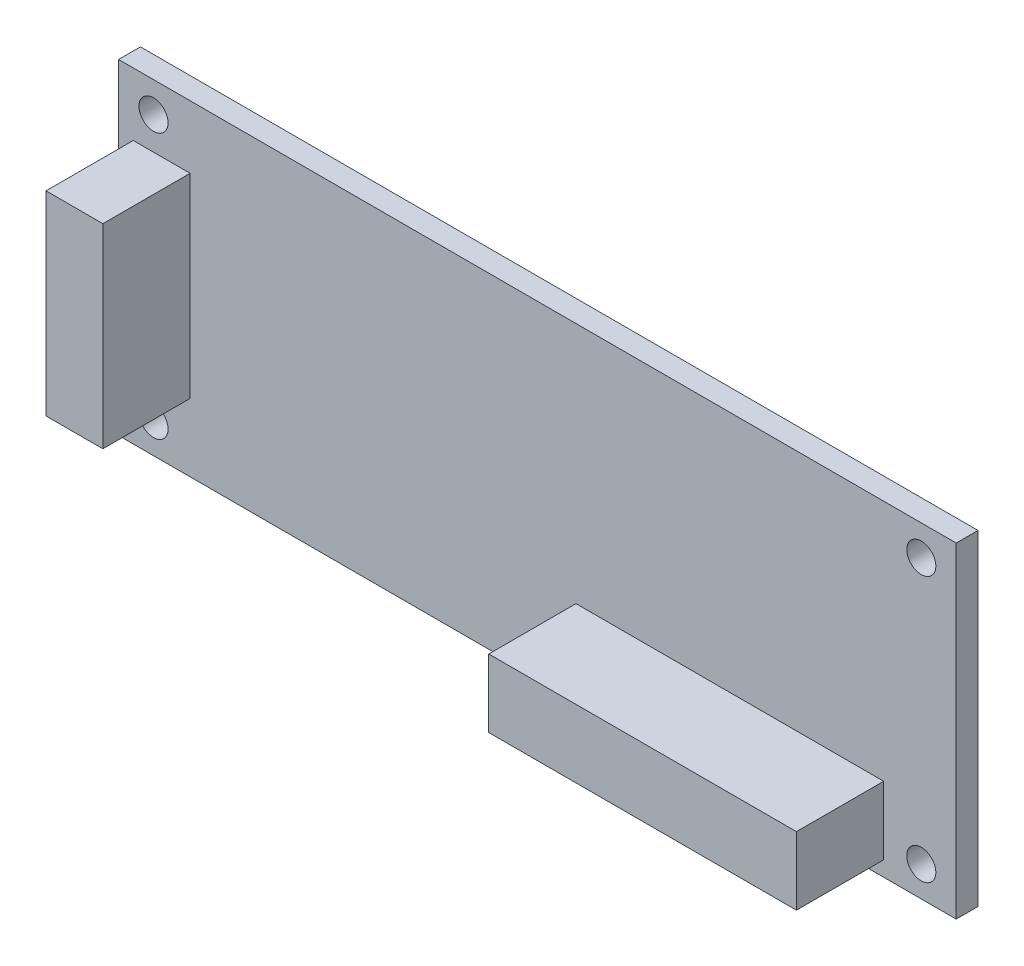
ISO-10303-21;
HEADER;
FILE_DESCRIPTION(('STEP AP214'),'2;1');
FILE_NAME('part.step','',(''),(''),'','','');
FILE_SCHEMA(('AUTOMOTIVE_DESIGN { 1 0 10303 214 1 1 1 1 }'));
ENDSEC;
DATA;
#1=APPLICATION_CONTEXT('core data for automotive mechanical design processes');
#2=APPLICATION_PROTOCOL_DEFINITION('international standard','automotive_design',2000,#1);
#3=PRODUCT_CONTEXT('',#1,'mechanical');
#4=PRODUCT('Part','Part','',(#3));
#5=PRODUCT_RELATED_PRODUCT_CATEGORY('part','',(#4));
#6=PRODUCT_DEFINITION_FORMATION('','',#4);
#7=PRODUCT_DEFINITION_CONTEXT('part definition',#1,'design');
#8=PRODUCT_DEFINITION('design','',#6,#7);
#9=PRODUCT_DEFINITION_SHAPE('','',#8);
#10=(LENGTH_UNIT() NAMED_UNIT(*) SI_UNIT(.MILLI.,.METRE.));
#11=(NAMED_UNIT(*) PLANE_ANGLE_UNIT() SI_UNIT($,.RADIAN.));
#12=(NAMED_UNIT(*) SI_UNIT($,.STERADIAN.) SOLID_ANGLE_UNIT());
#13=UNCERTAINTY_MEASURE_WITH_UNIT(LENGTH_MEASURE(1.E-05),#10,'distance_accuracy_value','');
#14=(GEOMETRIC_REPRESENTATION_CONTEXT(3) GLOBAL_UNCERTAINTY_ASSIGNED_CONTEXT((#13)) GLOBAL_UNIT_ASSIGNED_CONTEXT((#10,
#11,#12)) REPRESENTATION_CONTEXT('',''));
#15=CARTESIAN_POINT('',(0.,0.,0.));
#16=DIRECTION('',(0.,0.,1.));
#17=DIRECTION('',(1.,0.,0.));
#18=AXIS2_PLACEMENT_3D('',#15,#16,#17);
#19=CARTESIAN_POINT('',(0.,0.,2.38125));
#20=DIRECTION('',(0.,0.,-1.));
#21=DIRECTION('',(-1.,0.,0.));
#22=AXIS2_PLACEMENT_3D('',#19,#20,#21);
#23=PLANE('',#22);
#24=DIRECTION('',(0.,-1.,0.));
#25=VECTOR('',#24,1.);
#26=CARTESIAN_POINT('',(-44.1229269819009,10.9198701198926,2.38125));
#27=LINE('',#26,#25);
#28=CARTESIAN_POINT('',(-44.1229269819009,10.9198701198926,2.38125));
#29=VERTEX_POINT('',#28);
#30=CARTESIAN_POINT('',(-44.1229269819009,-10.3655619919792,2.38125));
#31=VERTEX_POINT('',#30);
#32=EDGE_CURVE('E158',#29,#31,#27,.T.);
#33=ORIENTED_EDGE('',*,*,#32,.F.);
#34=DIRECTION('',(-1.,0.,0.));
#35=VECTOR('',#34,1.);
#36=CARTESIAN_POINT('',(-44.1229269819009,10.9198701198926,2.38125));
#37=LINE('',#36,#35);
#38=CARTESIAN_POINT('',(-37.9146759492716,10.9198701198926,2.38125));
#39=VERTEX_POINT('',#38);
#40=EDGE_CURVE('E173',#39,#29,#37,.T.);
#41=ORIENTED_EDGE('',*,*,#40,.F.);
#42=DIRECTION('',(0.,1.,0.));
#43=VECTOR('',#42,1.);
#44=CARTESIAN_POINT('',(-37.9146759492716,10.9198701198926,2.38125));
#45=LINE('',#44,#43);
#46=CARTESIAN_POINT('',(-37.9146759492716,-10.3655619919792,2.38125));
#47=VERTEX_POINT('',#46);
#48=EDGE_CURVE('E184',#47,#39,#45,.T.);
#49=ORIENTED_EDGE('',*,*,#48,.F.);
#50=DIRECTION('',(1.,0.,0.));
#51=VECTOR('',#50,1.);
#52=CARTESIAN_POINT('',(-44.1229269819009,-10.3655619919792,2.38125));
#53=LINE('',#52,#51);
#54=EDGE_CURVE('E162',#31,#47,#53,.T.);
#55=ORIENTED_EDGE('',*,*,#54,.F.);
#56=EDGE_LOOP('',(#33,#41,#49,#55));
#57=FACE_BOUND('',#56,.T.);
#58=CARTESIAN_POINT('',(41.91,14.478,2.38125));
#59=DIRECTION('',(0.,0.,-1.));
#60=DIRECTION('',(-1.,0.,0.));
#61=AXIS2_PLACEMENT_3D('',#58,#59,#60);
#62=CIRCLE('',#61,1.5875);
#63=CARTESIAN_POINT('',(43.4975,14.478,2.38125));
#64=VERTEX_POINT('',#63);
#65=EDGE_CURVE('E214',#64,#64,#62,.T.);
#66=ORIENTED_EDGE('',*,*,#65,.T.);
#67=EDGE_LOOP('',(#66));
#68=FACE_BOUND('',#67,.T.);
#69=CARTESIAN_POINT('',(-41.91,14.478,2.38125));
#70=DIRECTION('',(0.,0.,1.));
#71=DIRECTION('',(1.,0.,0.));
#72=AXIS2_PLACEMENT_3D('',#69,#70,#71);
#73=CIRCLE('',#72,1.5875);
#74=CARTESIAN_POINT('',(-40.3225,14.478,2.38125));
#75=VERTEX_POINT('',#74);
#76=EDGE_CURVE('E220',#75,#75,#73,.T.);
#77=ORIENTED_EDGE('',*,*,#76,.F.);
#78=EDGE_LOOP('',(#77));
#79=FACE_BOUND('',#78,.T.);
#80=DIRECTION('',(0.,1.,0.));
#81=VECTOR('',#80,1.);
#82=CARTESIAN_POINT('',(45.72,-17.78,2.38125));
#83=LINE('',#82,#81);
#84=CARTESIAN_POINT('',(45.72,-17.78,2.38125));
#85=VERTEX_POINT('',#84);
#86=CARTESIAN_POINT('',(45.72,17.78,2.38125));
#87=VERTEX_POINT('',#86);
#88=EDGE_CURVE('E231',#85,#87,#83,.T.);
#89=ORIENTED_EDGE('',*,*,#88,.T.);
#90=DIRECTION('',(-1.,0.,0.));
#91=VECTOR('',#90,1.);
#92=CARTESIAN_POINT('',(-45.72,17.78,2.38125));
#93=LINE('',#92,#91);
#94=CARTESIAN_POINT('',(-45.72,17.78,2.38125));
#95=VERTEX_POINT('',#94);
#96=EDGE_CURVE('E234',#87,#95,#93,.T.);
#97=ORIENTED_EDGE('',*,*,#96,.T.);
#98=DIRECTION('',(0.,-1.,0.));
#99=VECTOR('',#98,1.);
#100=CARTESIAN_POINT('',(-45.72,-17.78,2.38125));
#101=LINE('',#100,#99);
#102=CARTESIAN_POINT('',(-45.72,-17.78,2.38125));
#103=VERTEX_POINT('',#102);
#104=EDGE_CURVE('E238',#95,#103,#101,.T.);
#105=ORIENTED_EDGE('',*,*,#104,.T.);
#106=DIRECTION('',(1.,0.,0.));
#107=VECTOR('',#106,1.);
#108=CARTESIAN_POINT('',(-45.72,-17.78,2.38125));
#109=LINE('',#108,#107);
#110=EDGE_CURVE('E241',#103,#85,#109,.T.);
#111=ORIENTED_EDGE('',*,*,#110,.T.);
#112=EDGE_LOOP('',(#89,#97,#105,#111));
#113=FACE_BOUND('',#112,.T.);
#114=CARTESIAN_POINT('',(41.91,-14.478,2.38125));
#115=DIRECTION('',(0.,0.,1.));
#116=DIRECTION('',(-1.,0.,0.));
#117=AXIS2_PLACEMENT_3D('',#114,#115,#116);
#118=CIRCLE('',#117,1.5875);
#119=CARTESIAN_POINT('',(43.4975,-14.478,2.38125));
#120=VERTEX_POINT('',#119);
#121=EDGE_CURVE('E208',#120,#120,#118,.T.);
#122=ORIENTED_EDGE('',*,*,#121,.F.);
#123=EDGE_LOOP('',(#122));
#124=FACE_BOUND('',#123,.T.);
#125=CARTESIAN_POINT('',(-41.91,-14.478,2.38125));
#126=DIRECTION('',(0.,0.,-1.));
#127=DIRECTION('',(1.,0.,0.));
#128=AXIS2_PLACEMENT_3D('',#125,#126,#127);
#129=CIRCLE('',#128,1.5875);
#130=CARTESIAN_POINT('',(-40.3225,-14.478,2.38125));
#131=VERTEX_POINT('',#130);
#132=EDGE_CURVE('E204',#131,#131,#129,.T.);
#133=ORIENTED_EDGE('',*,*,#132,.T.);
#134=EDGE_LOOP('',(#133));
#135=FACE_BOUND('',#134,.T.);
#136=DIRECTION('',(0.,1.,0.));
#137=VECTOR('',#136,1.);
#138=CARTESIAN_POINT('',(37.8038143236889,-16.1303665222778,2.38125));
#139=LINE('',#138,#137);
#140=CARTESIAN_POINT('',(37.8038143236889,-16.1303665222778,2.38125));
#141=VERTEX_POINT('',#140);
#142=CARTESIAN_POINT('',(37.8038143236889,-8.70263760823924,2.38125));
#143=VERTEX_POINT('',#142);
#144=EDGE_CURVE('E157',#141,#143,#139,.T.);
#145=ORIENTED_EDGE('',*,*,#144,.F.);
#146=DIRECTION('',(1.,0.,0.));
#147=VECTOR('',#146,1.);
#148=CARTESIAN_POINT('',(37.8038143236889,-16.1303665222778,2.38125));
#149=LINE('',#148,#147);
#150=CARTESIAN_POINT('',(4.21274177214127,-16.1303665222778,2.38125));
#151=VERTEX_POINT('',#150);
#152=EDGE_CURVE('E154',#151,#141,#149,.T.);
#153=ORIENTED_EDGE('',*,*,#152,.F.);
#154=DIRECTION('',(0.,-1.,0.));
#155=VECTOR('',#154,1.);
#156=CARTESIAN_POINT('',(4.21274177214127,-16.1303665222778,2.38125));
#157=LINE('',#156,#155);
#158=CARTESIAN_POINT('',(4.21274177214127,-8.70263760823924,2.38125));
#159=VERTEX_POINT('',#158);
#160=EDGE_CURVE('E62',#159,#151,#157,.T.);
#161=ORIENTED_EDGE('',*,*,#160,.F.);
#162=DIRECTION('',(-1.,0.,0.));
#163=VECTOR('',#162,1.);
#164=CARTESIAN_POINT('',(37.8038143236889,-8.70263760823924,2.38125));
#165=LINE('',#164,#163);
#166=EDGE_CURVE('E57',#143,#159,#165,.T.);
#167=ORIENTED_EDGE('',*,*,#166,.F.);
#168=EDGE_LOOP('',(#145,#153,#161,#167));
#169=FACE_BOUND('',#168,.T.);
#170=ADVANCED_FACE('F42',(#57,#68,#79,#113,#124,#135,#169),#23,.F.);
#171=CARTESIAN_POINT('',(0.,0.,0.));
#172=DIRECTION('',(0.,0.,-1.));
#173=DIRECTION('',(-1.,0.,0.));
#174=AXIS2_PLACEMENT_3D('',#171,#172,#173);
#175=PLANE('',#174);
#176=CARTESIAN_POINT('',(41.91,14.478,0.));
#177=DIRECTION('',(0.,0.,-1.));
#178=DIRECTION('',(-1.,0.,0.));
#179=AXIS2_PLACEMENT_3D('',#176,#177,#178);
#180=CIRCLE('',#179,1.5875);
#181=CARTESIAN_POINT('',(43.4975,14.478,0.));
#182=VERTEX_POINT('',#181);
#183=EDGE_CURVE('E217',#182,#182,#180,.T.);
#184=ORIENTED_EDGE('',*,*,#183,.F.);
#185=EDGE_LOOP('',(#184));
#186=FACE_BOUND('',#185,.T.);
#187=CARTESIAN_POINT('',(-41.91,14.478,0.));
#188=DIRECTION('',(0.,0.,1.));
#189=DIRECTION('',(1.,0.,0.));
#190=AXIS2_PLACEMENT_3D('',#187,#188,#189);
#191=CIRCLE('',#190,1.5875);
#192=CARTESIAN_POINT('',(-40.3225,14.478,0.));
#193=VERTEX_POINT('',#192);
#194=EDGE_CURVE('E223',#193,#193,#191,.T.);
#195=ORIENTED_EDGE('',*,*,#194,.T.);
#196=EDGE_LOOP('',(#195));
#197=FACE_BOUND('',#196,.T.);
#198=DIRECTION('',(0.,1.,0.));
#199=VECTOR('',#198,1.);
#200=CARTESIAN_POINT('',(45.72,-17.78,0.));
#201=LINE('',#200,#199);
#202=CARTESIAN_POINT('',(45.72,-17.78,0.));
#203=VERTEX_POINT('',#202);
#204=CARTESIAN_POINT('',(45.72,17.78,0.));
#205=VERTEX_POINT('',#204);
#206=EDGE_CURVE('E227',#203,#205,#201,.T.);
#207=ORIENTED_EDGE('',*,*,#206,.F.);
#208=DIRECTION('',(1.,0.,0.));
#209=VECTOR('',#208,1.);
#210=CARTESIAN_POINT('',(-45.72,-17.78,0.));
#211=LINE('',#210,#209);
#212=CARTESIAN_POINT('',(-45.72,-17.78,0.));
#213=VERTEX_POINT('',#212);
#214=EDGE_CURVE('E235',#213,#203,#211,.T.);
#215=ORIENTED_EDGE('',*,*,#214,.F.);
#216=DIRECTION('',(0.,-1.,0.));
#217=VECTOR('',#216,1.);
#218=CARTESIAN_POINT('',(-45.72,-17.78,0.));
#219=LINE('',#218,#217);
#220=CARTESIAN_POINT('',(-45.72,17.78,0.));
#221=VERTEX_POINT('',#220);
#222=EDGE_CURVE('E249',#221,#213,#219,.T.);
#223=ORIENTED_EDGE('',*,*,#222,.F.);
#224=DIRECTION('',(-1.,0.,0.));
#225=VECTOR('',#224,1.);
#226=CARTESIAN_POINT('',(-45.72,17.78,0.));
#227=LINE('',#226,#225);
#228=EDGE_CURVE('E246',#205,#221,#227,.T.);
#229=ORIENTED_EDGE('',*,*,#228,.F.);
#230=EDGE_LOOP('',(#207,#215,#223,#229));
#231=FACE_BOUND('',#230,.T.);
#232=CARTESIAN_POINT('',(41.91,-14.478,0.));
#233=DIRECTION('',(0.,0.,1.));
#234=DIRECTION('',(-1.,0.,0.));
#235=AXIS2_PLACEMENT_3D('',#232,#233,#234);
#236=CIRCLE('',#235,1.5875);
#237=CARTESIAN_POINT('',(43.4975,-14.478,0.));
#238=VERTEX_POINT('',#237);
#239=EDGE_CURVE('E211',#238,#238,#236,.T.);
#240=ORIENTED_EDGE('',*,*,#239,.T.);
#241=EDGE_LOOP('',(#240));
#242=FACE_BOUND('',#241,.T.);
#243=CARTESIAN_POINT('',(-41.91,-14.478,0.));
#244=DIRECTION('',(0.,0.,-1.));
#245=DIRECTION('',(1.,0.,0.));
#246=AXIS2_PLACEMENT_3D('',#243,#244,#245);
#247=CIRCLE('',#246,1.5875);
#248=CARTESIAN_POINT('',(-40.3225,-14.478,0.));
#249=VERTEX_POINT('',#248);
#250=EDGE_CURVE('E205',#249,#249,#247,.T.);
#251=ORIENTED_EDGE('',*,*,#250,.F.);
#252=EDGE_LOOP('',(#251));
#253=FACE_BOUND('',#252,.T.);
#254=ADVANCED_FACE('F269',(#186,#197,#231,#242,#253),#175,.T.);
#255=CARTESIAN_POINT('',(45.72,-17.78,2.38125));
#256=DIRECTION('',(-1.,0.,0.));
#257=DIRECTION('',(0.,0.,1.));
#258=AXIS2_PLACEMENT_3D('',#255,#256,#257);
#259=PLANE('',#258);
#260=ORIENTED_EDGE('',*,*,#206,.T.);
#261=DIRECTION('',(0.,0.,-1.));
#262=VECTOR('',#261,1.);
#263=CARTESIAN_POINT('',(45.72,17.78,2.38125));
#264=LINE('',#263,#262);
#265=EDGE_CURVE('E11',#87,#205,#264,.T.);
#266=ORIENTED_EDGE('',*,*,#265,.F.);
#267=ORIENTED_EDGE('',*,*,#88,.F.);
#268=DIRECTION('',(0.,0.,-1.));
#269=VECTOR('',#268,1.);
#270=CARTESIAN_POINT('',(45.72,-17.78,2.38125));
#271=LINE('',#270,#269);
#272=EDGE_CURVE('E243',#85,#203,#271,.T.);
#273=ORIENTED_EDGE('',*,*,#272,.T.);
#274=EDGE_LOOP('',(#260,#266,#267,#273));
#275=FACE_BOUND('',#274,.T.);
#276=ADVANCED_FACE('F44',(#275),#259,.F.);
#277=CARTESIAN_POINT('',(-45.72,17.78,2.38125));
#278=DIRECTION('',(0.,-1.,0.));
#279=DIRECTION('',(0.,0.,-1.));
#280=AXIS2_PLACEMENT_3D('',#277,#278,#279);
#281=PLANE('',#280);
#282=ORIENTED_EDGE('',*,*,#228,.T.);
#283=DIRECTION('',(0.,0.,-1.));
#284=VECTOR('',#283,1.);
#285=CARTESIAN_POINT('',(-45.72,17.78,2.38125));
#286=LINE('',#285,#284);
#287=EDGE_CURVE('E50',#95,#221,#286,.T.);
#288=ORIENTED_EDGE('',*,*,#287,.F.);
#289=ORIENTED_EDGE('',*,*,#96,.F.);
#290=ORIENTED_EDGE('',*,*,#265,.T.);
#291=EDGE_LOOP('',(#282,#288,#289,#290));
#292=FACE_BOUND('',#291,.T.);
#293=ADVANCED_FACE('F280',(#292),#281,.F.);
#294=CARTESIAN_POINT('',(-45.72,-17.78,2.38125));
#295=DIRECTION('',(1.,0.,0.));
#296=DIRECTION('',(0.,0.,-1.));
#297=AXIS2_PLACEMENT_3D('',#294,#295,#296);
#298=PLANE('',#297);
#299=ORIENTED_EDGE('',*,*,#222,.T.);
#300=DIRECTION('',(0.,0.,-1.));
#301=VECTOR('',#300,1.);
#302=CARTESIAN_POINT('',(-45.72,-17.78,2.38125));
#303=LINE('',#302,#301);
#304=EDGE_CURVE('E255',#103,#213,#303,.T.);
#305=ORIENTED_EDGE('',*,*,#304,.F.);
#306=ORIENTED_EDGE('',*,*,#104,.F.);
#307=ORIENTED_EDGE('',*,*,#287,.T.);
#308=EDGE_LOOP('',(#299,#305,#306,#307));
#309=FACE_BOUND('',#308,.T.);
#310=ADVANCED_FACE('F263',(#309),#298,.F.);
#311=CARTESIAN_POINT('',(-45.72,-17.78,2.38125));
#312=DIRECTION('',(0.,1.,0.));
#313=DIRECTION('',(0.,0.,1.));
#314=AXIS2_PLACEMENT_3D('',#311,#312,#313);
#315=PLANE('',#314);
#316=ORIENTED_EDGE('',*,*,#214,.T.);
#317=ORIENTED_EDGE('',*,*,#272,.F.);
#318=ORIENTED_EDGE('',*,*,#110,.F.);
#319=ORIENTED_EDGE('',*,*,#304,.T.);
#320=EDGE_LOOP('',(#316,#317,#318,#319));
#321=FACE_BOUND('',#320,.T.);
#322=ADVANCED_FACE('F273',(#321),#315,.F.);
#323=CARTESIAN_POINT('',(-41.91,14.478,0.));
#324=DIRECTION('',(0.,0.,1.));
#325=DIRECTION('',(1.,0.,0.));
#326=AXIS2_PLACEMENT_3D('',#323,#324,#325);
#327=CYLINDRICAL_SURFACE('',#326,1.5875);
#328=CARTESIAN_POINT('',(-40.3225,14.478,0.));
#329=CARTESIAN_POINT('',(-40.3225,14.478,0.0248046875));
#330=CARTESIAN_POINT('',(-40.3225,14.478,0.049609375));
#331=CARTESIAN_POINT('',(-40.3225,14.478,0.09921875));
#332=CARTESIAN_POINT('',(-40.3225,14.478,0.1240234375));
#333=CARTESIAN_POINT('',(-40.3225,14.478,0.1736328125));
#334=CARTESIAN_POINT('',(-40.3225,14.478,0.1984375));
#335=CARTESIAN_POINT('',(-40.3225,14.478,0.248046875));
#336=CARTESIAN_POINT('',(-40.3225,14.478,0.2728515625));
#337=CARTESIAN_POINT('',(-40.3225,14.478,0.3224609375));
#338=CARTESIAN_POINT('',(-40.3225,14.478,0.347265625));
#339=CARTESIAN_POINT('',(-40.3225,14.478,0.396875));
#340=CARTESIAN_POINT('',(-40.3225,14.478,0.4216796875));
#341=CARTESIAN_POINT('',(-40.3225,14.478,0.4712890625));
#342=CARTESIAN_POINT('',(-40.3225,14.478,0.49609375));
#343=CARTESIAN_POINT('',(-40.3225,14.478,0.545703125));
#344=CARTESIAN_POINT('',(-40.3225,14.478,0.5705078125));
#345=CARTESIAN_POINT('',(-40.3225,14.478,0.6201171875));
#346=CARTESIAN_POINT('',(-40.3225,14.478,0.644921875));
#347=CARTESIAN_POINT('',(-40.3225,14.478,0.69453125));
#348=CARTESIAN_POINT('',(-40.3225,14.478,0.7193359375));
#349=CARTESIAN_POINT('',(-40.3225,14.478,0.7689453125));
#350=CARTESIAN_POINT('',(-40.3225,14.478,0.79375));
#351=CARTESIAN_POINT('',(-40.3225,14.478,0.843359375));
#352=CARTESIAN_POINT('',(-40.3225,14.478,0.8681640625));
#353=CARTESIAN_POINT('',(-40.3225,14.478,0.9177734375));
#354=CARTESIAN_POINT('',(-40.3225,14.478,0.942578125));
#355=CARTESIAN_POINT('',(-40.3225,14.478,0.9921875));
#356=CARTESIAN_POINT('',(-40.3225,14.478,1.0169921875));
#357=CARTESIAN_POINT('',(-40.3225,14.478,1.0666015625));
#358=CARTESIAN_POINT('',(-40.3225,14.478,1.09140625));
#359=CARTESIAN_POINT('',(-40.3225,14.478,1.141015625));
#360=CARTESIAN_POINT('',(-40.3225,14.478,1.1658203125));
#361=CARTESIAN_POINT('',(-40.3225,14.478,1.2154296875));
#362=CARTESIAN_POINT('',(-40.3225,14.478,1.240234375));
#363=CARTESIAN_POINT('',(-40.3225,14.478,1.28984375));
#364=CARTESIAN_POINT('',(-40.3225,14.478,1.3146484375));
#365=CARTESIAN_POINT('',(-40.3225,14.478,1.3642578125));
#366=CARTESIAN_POINT('',(-40.3225,14.478,1.3890625));
#367=CARTESIAN_POINT('',(-40.3225,14.478,1.438671875));
#368=CARTESIAN_POINT('',(-40.3225,14.478,1.4634765625));
#369=CARTESIAN_POINT('',(-40.3225,14.478,1.5130859375));
#370=CARTESIAN_POINT('',(-40.3225,14.478,1.537890625));
#371=CARTESIAN_POINT('',(-40.3225,14.478,1.5875));
#372=CARTESIAN_POINT('',(-40.3225,14.478,1.6123046875));
#373=CARTESIAN_POINT('',(-40.3225,14.478,1.6619140625));
#374=CARTESIAN_POINT('',(-40.3225,14.478,1.68671875));
#375=CARTESIAN_POINT('',(-40.3225,14.478,1.736328125));
#376=CARTESIAN_POINT('',(-40.3225,14.478,1.7611328125));
#377=CARTESIAN_POINT('',(-40.3225,14.478,1.8107421875));
#378=CARTESIAN_POINT('',(-40.3225,14.478,1.835546875));
#379=CARTESIAN_POINT('',(-40.3225,14.478,1.88515625));
#380=CARTESIAN_POINT('',(-40.3225,14.478,1.9099609375));
#381=CARTESIAN_POINT('',(-40.3225,14.478,1.9595703125));
#382=CARTESIAN_POINT('',(-40.3225,14.478,1.984375));
#383=CARTESIAN_POINT('',(-40.3225,14.478,2.033984375));
#384=CARTESIAN_POINT('',(-40.3225,14.478,2.0587890625));
#385=CARTESIAN_POINT('',(-40.3225,14.478,2.1083984375));
#386=CARTESIAN_POINT('',(-40.3225,14.478,2.133203125));
#387=CARTESIAN_POINT('',(-40.3225,14.478,2.1828125));
#388=CARTESIAN_POINT('',(-40.3225,14.478,2.2076171875));
#389=CARTESIAN_POINT('',(-40.3225,14.478,2.2572265625));
#390=CARTESIAN_POINT('',(-40.3225,14.478,2.28203125));
#391=CARTESIAN_POINT('',(-40.3225,14.478,2.331640625));
#392=CARTESIAN_POINT('',(-40.3225,14.478,2.3564453125));
#393=CARTESIAN_POINT('',(-40.3225,14.478,2.38125));
#394=B_SPLINE_CURVE_WITH_KNOTS('',3,(#328,#329,#330,#331,#332,#333,#334,#335,#336,#337,#338,
#339,#340,#341,#342,#343,#344,#345,#346,#347,#348,#349,#350,#351,#352,#353,#354,#355,#356,#357,
#358,#359,#360,#361,#362,#363,#364,#365,#366,#367,#368,#369,#370,#371,#372,#373,#374,#375,#376,
#377,#378,#379,#380,#381,#382,#383,#384,#385,#386,#387,#388,#389,#390,#391,#392,#393),
.UNSPECIFIED.,.F.,.F.,(4,2,2,2,2,2,2,2,2,2,2,2,2,2,2,2,2,2,2,2,2,2,2,2,2,2,2,2,2,2,2,2,4),(0.,
0.0744140625,0.148828125,0.2232421875,0.29765625,0.3720703125,0.446484375,0.5208984375,
0.5953125,0.6697265625,0.744140625,0.8185546875,0.89296875,0.9673828125,1.041796875,
1.1162109375,1.190625,1.2650390625,1.339453125,1.4138671875,1.48828125,1.5626953125,1.637109375,
1.7115234375,1.7859375,1.8603515625,1.934765625,2.0091796875,2.08359375,2.1580078125,
2.232421875,2.3068359375,2.38125),.UNSPECIFIED.);
#395=EDGE_CURVE('BSEAM296',#193,#75,#394,.T.);
#396=ORIENTED_EDGE('',*,*,#194,.F.);
#397=ORIENTED_EDGE('',*,*,#76,.T.);
#398=ORIENTED_EDGE('',*,*,#395,.T.);
#399=ORIENTED_EDGE('',*,*,#395,.F.);
#400=EDGE_LOOP('',(#396,#398,#397,#399));
#401=FACE_BOUND('',#400,.T.);
#402=ADVANCED_FACE('F296',(#401),#327,.F.);
#403=CARTESIAN_POINT('',(41.91,14.478,0.));
#404=DIRECTION('',(0.,0.,1.));
#405=DIRECTION('',(1.,0.,0.));
#406=AXIS2_PLACEMENT_3D('',#403,#404,#405);
#407=CYLINDRICAL_SURFACE('',#406,1.5875);
#408=CARTESIAN_POINT('',(43.4975,14.478,0.));
#409=CARTESIAN_POINT('',(43.4975,14.478,0.0248046875));
#410=CARTESIAN_POINT('',(43.4975,14.478,0.049609375));
#411=CARTESIAN_POINT('',(43.4975,14.478,0.09921875));
#412=CARTESIAN_POINT('',(43.4975,14.478,0.1240234375));
#413=CARTESIAN_POINT('',(43.4975,14.478,0.1736328125));
#414=CARTESIAN_POINT('',(43.4975,14.478,0.1984375));
#415=CARTESIAN_POINT('',(43.4975,14.478,0.248046875));
#416=CARTESIAN_POINT('',(43.4975,14.478,0.2728515625));
#417=CARTESIAN_POINT('',(43.4975,14.478,0.3224609375));
#418=CARTESIAN_POINT('',(43.4975,14.478,0.347265625));
#419=CARTESIAN_POINT('',(43.4975,14.478,0.396875));
#420=CARTESIAN_POINT('',(43.4975,14.478,0.4216796875));
#421=CARTESIAN_POINT('',(43.4975,14.478,0.4712890625));
#422=CARTESIAN_POINT('',(43.4975,14.478,0.49609375));
#423=CARTESIAN_POINT('',(43.4975,14.478,0.545703125));
#424=CARTESIAN_POINT('',(43.4975,14.478,0.5705078125));
#425=CARTESIAN_POINT('',(43.4975,14.478,0.6201171875));
#426=CARTESIAN_POINT('',(43.4975,14.478,0.644921875));
#427=CARTESIAN_POINT('',(43.4975,14.478,0.69453125));
#428=CARTESIAN_POINT('',(43.4975,14.478,0.7193359375));
#429=CARTESIAN_POINT('',(43.4975,14.478,0.7689453125));
#430=CARTESIAN_POINT('',(43.4975,14.478,0.79375));
#431=CARTESIAN_POINT('',(43.4975,14.478,0.843359375));
#432=CARTESIAN_POINT('',(43.4975,14.478,0.8681640625));
#433=CARTESIAN_POINT('',(43.4975,14.478,0.9177734375));
#434=CARTESIAN_POINT('',(43.4975,14.478,0.942578125));
#435=CARTESIAN_POINT('',(43.4975,14.478,0.9921875));
#436=CARTESIAN_POINT('',(43.4975,14.478,1.0169921875));
#437=CARTESIAN_POINT('',(43.4975,14.478,1.0666015625));
#438=CARTESIAN_POINT('',(43.4975,14.478,1.09140625));
#439=CARTESIAN_POINT('',(43.4975,14.478,1.141015625));
#440=CARTESIAN_POINT('',(43.4975,14.478,1.1658203125));
#441=CARTESIAN_POINT('',(43.4975,14.478,1.2154296875));
#442=CARTESIAN_POINT('',(43.4975,14.478,1.240234375));
#443=CARTESIAN_POINT('',(43.4975,14.478,1.28984375));
#444=CARTESIAN_POINT('',(43.4975,14.478,1.3146484375));
#445=CARTESIAN_POINT('',(43.4975,14.478,1.3642578125));
#446=CARTESIAN_POINT('',(43.4975,14.478,1.3890625));
#447=CARTESIAN_POINT('',(43.4975,14.478,1.438671875));
#448=CARTESIAN_POINT('',(43.4975,14.478,1.4634765625));
#449=CARTESIAN_POINT('',(43.4975,14.478,1.5130859375));
#450=CARTESIAN_POINT('',(43.4975,14.478,1.537890625));
#451=CARTESIAN_POINT('',(43.4975,14.478,1.5875));
#452=CARTESIAN_POINT('',(43.4975,14.478,1.6123046875));
#453=CARTESIAN_POINT('',(43.4975,14.478,1.6619140625));
#454=CARTESIAN_POINT('',(43.4975,14.478,1.68671875));
#455=CARTESIAN_POINT('',(43.4975,14.478,1.736328125));
#456=CARTESIAN_POINT('',(43.4975,14.478,1.7611328125));
#457=CARTESIAN_POINT('',(43.4975,14.478,1.8107421875));
#458=CARTESIAN_POINT('',(43.4975,14.478,1.835546875));
#459=CARTESIAN_POINT('',(43.4975,14.478,1.88515625));
#460=CARTESIAN_POINT('',(43.4975,14.478,1.9099609375));
#461=CARTESIAN_POINT('',(43.4975,14.478,1.9595703125));
#462=CARTESIAN_POINT('',(43.4975,14.478,1.984375));
#463=CARTESIAN_POINT('',(43.4975,14.478,2.033984375));
#464=CARTESIAN_POINT('',(43.4975,14.478,2.0587890625));
#465=CARTESIAN_POINT('',(43.4975,14.478,2.1083984375));
#466=CARTESIAN_POINT('',(43.4975,14.478,2.133203125));
#467=CARTESIAN_POINT('',(43.4975,14.478,2.1828125));
#468=CARTESIAN_POINT('',(43.4975,14.478,2.2076171875));
#469=CARTESIAN_POINT('',(43.4975,14.478,2.2572265625));
#470=CARTESIAN_POINT('',(43.4975,14.478,2.28203125));
#471=CARTESIAN_POINT('',(43.4975,14.478,2.331640625));
#472=CARTESIAN_POINT('',(43.4975,14.478,2.3564453125));
#473=CARTESIAN_POINT('',(43.4975,14.478,2.38125));
#474=B_SPLINE_CURVE_WITH_KNOTS('',3,(#408,#409,#410,#411,#412,#413,#414,#415,#416,#417,#418,
#419,#420,#421,#422,#423,#424,#425,#426,#427,#428,#429,#430,#431,#432,#433,#434,#435,#436,#437,
#438,#439,#440,#441,#442,#443,#444,#445,#446,#447,#448,#449,#450,#451,#452,#453,#454,#455,#456,
#457,#458,#459,#460,#461,#462,#463,#464,#465,#466,#467,#468,#469,#470,#471,#472,#473),
.UNSPECIFIED.,.F.,.F.,(4,2,2,2,2,2,2,2,2,2,2,2,2,2,2,2,2,2,2,2,2,2,2,2,2,2,2,2,2,2,2,2,4),(0.,
0.0744140625,0.148828125,0.2232421875,0.29765625,0.3720703125,0.446484375,0.5208984375,
0.5953125,0.6697265625,0.744140625,0.8185546875,0.89296875,0.9673828125,1.041796875,
1.1162109375,1.190625,1.2650390625,1.339453125,1.4138671875,1.48828125,1.5626953125,1.637109375,
1.7115234375,1.7859375,1.8603515625,1.934765625,2.0091796875,2.08359375,2.1580078125,
2.232421875,2.3068359375,2.38125),.UNSPECIFIED.);
#475=EDGE_CURVE('BSEAM303',#182,#64,#474,.T.);
#476=ORIENTED_EDGE('',*,*,#183,.T.);
#477=ORIENTED_EDGE('',*,*,#65,.F.);
#478=ORIENTED_EDGE('',*,*,#475,.T.);
#479=ORIENTED_EDGE('',*,*,#475,.F.);
#480=EDGE_LOOP('',(#476,#478,#477,#479));
#481=FACE_BOUND('',#480,.T.);
#482=ADVANCED_FACE('F303',(#481),#407,.F.);
#483=CARTESIAN_POINT('',(41.91,-14.478,0.));
#484=DIRECTION('',(0.,0.,1.));
#485=DIRECTION('',(1.,0.,0.));
#486=AXIS2_PLACEMENT_3D('',#483,#484,#485);
#487=CYLINDRICAL_SURFACE('',#486,1.5875);
#488=CARTESIAN_POINT('',(43.4975,-14.478,0.));
#489=CARTESIAN_POINT('',(43.4975,-14.478,0.0248046875));
#490=CARTESIAN_POINT('',(43.4975,-14.478,0.049609375));
#491=CARTESIAN_POINT('',(43.4975,-14.478,0.09921875));
#492=CARTESIAN_POINT('',(43.4975,-14.478,0.1240234375));
#493=CARTESIAN_POINT('',(43.4975,-14.478,0.1736328125));
#494=CARTESIAN_POINT('',(43.4975,-14.478,0.1984375));
#495=CARTESIAN_POINT('',(43.4975,-14.478,0.248046875));
#496=CARTESIAN_POINT('',(43.4975,-14.478,0.2728515625));
#497=CARTESIAN_POINT('',(43.4975,-14.478,0.3224609375));
#498=CARTESIAN_POINT('',(43.4975,-14.478,0.347265625));
#499=CARTESIAN_POINT('',(43.4975,-14.478,0.396875));
#500=CARTESIAN_POINT('',(43.4975,-14.478,0.4216796875));
#501=CARTESIAN_POINT('',(43.4975,-14.478,0.4712890625));
#502=CARTESIAN_POINT('',(43.4975,-14.478,0.49609375));
#503=CARTESIAN_POINT('',(43.4975,-14.478,0.545703125));
#504=CARTESIAN_POINT('',(43.4975,-14.478,0.5705078125));
#505=CARTESIAN_POINT('',(43.4975,-14.478,0.6201171875));
#506=CARTESIAN_POINT('',(43.4975,-14.478,0.644921875));
#507=CARTESIAN_POINT('',(43.4975,-14.478,0.69453125));
#508=CARTESIAN_POINT('',(43.4975,-14.478,0.7193359375));
#509=CARTESIAN_POINT('',(43.4975,-14.478,0.7689453125));
#510=CARTESIAN_POINT('',(43.4975,-14.478,0.79375));
#511=CARTESIAN_POINT('',(43.4975,-14.478,0.843359375));
#512=CARTESIAN_POINT('',(43.4975,-14.478,0.8681640625));
#513=CARTESIAN_POINT('',(43.4975,-14.478,0.9177734375));
#514=CARTESIAN_POINT('',(43.4975,-14.478,0.942578125));
#515=CARTESIAN_POINT('',(43.4975,-14.478,0.9921875));
#516=CARTESIAN_POINT('',(43.4975,-14.478,1.0169921875));
#517=CARTESIAN_POINT('',(43.4975,-14.478,1.0666015625));
#518=CARTESIAN_POINT('',(43.4975,-14.478,1.09140625));
#519=CARTESIAN_POINT('',(43.4975,-14.478,1.141015625));
#520=CARTESIAN_POINT('',(43.4975,-14.478,1.1658203125));
#521=CARTESIAN_POINT('',(43.4975,-14.478,1.2154296875));
#522=CARTESIAN_POINT('',(43.4975,-14.478,1.240234375));
#523=CARTESIAN_POINT('',(43.4975,-14.478,1.28984375));
#524=CARTESIAN_POINT('',(43.4975,-14.478,1.3146484375));
#525=CARTESIAN_POINT('',(43.4975,-14.478,1.3642578125));
#526=CARTESIAN_POINT('',(43.4975,-14.478,1.3890625));
#527=CARTESIAN_POINT('',(43.4975,-14.478,1.438671875));
#528=CARTESIAN_POINT('',(43.4975,-14.478,1.4634765625));
#529=CARTESIAN_POINT('',(43.4975,-14.478,1.5130859375));
#530=CARTESIAN_POINT('',(43.4975,-14.478,1.537890625));
#531=CARTESIAN_POINT('',(43.4975,-14.478,1.5875));
#532=CARTESIAN_POINT('',(43.4975,-14.478,1.6123046875));
#533=CARTESIAN_POINT('',(43.4975,-14.478,1.6619140625));
#534=CARTESIAN_POINT('',(43.4975,-14.478,1.68671875));
#535=CARTESIAN_POINT('',(43.4975,-14.478,1.736328125));
#536=CARTESIAN_POINT('',(43.4975,-14.478,1.7611328125));
#537=CARTESIAN_POINT('',(43.4975,-14.478,1.8107421875));
#538=CARTESIAN_POINT('',(43.4975,-14.478,1.835546875));
#539=CARTESIAN_POINT('',(43.4975,-14.478,1.88515625));
#540=CARTESIAN_POINT('',(43.4975,-14.478,1.9099609375));
#541=CARTESIAN_POINT('',(43.4975,-14.478,1.9595703125));
#542=CARTESIAN_POINT('',(43.4975,-14.478,1.984375));
#543=CARTESIAN_POINT('',(43.4975,-14.478,2.033984375));
#544=CARTESIAN_POINT('',(43.4975,-14.478,2.0587890625));
#545=CARTESIAN_POINT('',(43.4975,-14.478,2.1083984375));
#546=CARTESIAN_POINT('',(43.4975,-14.478,2.133203125));
#547=CARTESIAN_POINT('',(43.4975,-14.478,2.1828125));
#548=CARTESIAN_POINT('',(43.4975,-14.478,2.2076171875));
#549=CARTESIAN_POINT('',(43.4975,-14.478,2.2572265625));
#550=CARTESIAN_POINT('',(43.4975,-14.478,2.28203125));
#551=CARTESIAN_POINT('',(43.4975,-14.478,2.331640625));
#552=CARTESIAN_POINT('',(43.4975,-14.478,2.3564453125));
#553=CARTESIAN_POINT('',(43.4975,-14.478,2.38125));
#554=B_SPLINE_CURVE_WITH_KNOTS('',3,(#488,#489,#490,#491,#492,#493,#494,#495,#496,#497,#498,
#499,#500,#501,#502,#503,#504,#505,#506,#507,#508,#509,#510,#511,#512,#513,#514,#515,#516,#517,
#518,#519,#520,#521,#522,#523,#524,#525,#526,#527,#528,#529,#530,#531,#532,#533,#534,#535,#536,
#537,#538,#539,#540,#541,#542,#543,#544,#545,#546,#547,#548,#549,#550,#551,#552,#553),
.UNSPECIFIED.,.F.,.F.,(4,2,2,2,2,2,2,2,2,2,2,2,2,2,2,2,2,2,2,2,2,2,2,2,2,2,2,2,2,2,2,2,4),(0.,
0.0744140625,0.148828125,0.2232421875,0.29765625,0.3720703125,0.446484375,0.5208984375,
0.5953125,0.6697265625,0.744140625,0.8185546875,0.89296875,0.9673828125,1.041796875,
1.1162109375,1.190625,1.2650390625,1.339453125,1.4138671875,1.48828125,1.5626953125,1.637109375,
1.7115234375,1.7859375,1.8603515625,1.934765625,2.0091796875,2.08359375,2.1580078125,
2.232421875,2.3068359375,2.38125),.UNSPECIFIED.);
#555=EDGE_CURVE('BSEAM308',#238,#120,#554,.T.);
#556=ORIENTED_EDGE('',*,*,#239,.F.);
#557=ORIENTED_EDGE('',*,*,#121,.T.);
#558=ORIENTED_EDGE('',*,*,#555,.T.);
#559=ORIENTED_EDGE('',*,*,#555,.F.);
#560=EDGE_LOOP('',(#556,#558,#557,#559));
#561=FACE_BOUND('',#560,.T.);
#562=ADVANCED_FACE('F308',(#561),#487,.F.);
#563=CARTESIAN_POINT('',(-41.91,-14.478,0.));
#564=DIRECTION('',(0.,0.,1.));
#565=DIRECTION('',(1.,0.,0.));
#566=AXIS2_PLACEMENT_3D('',#563,#564,#565);
#567=CYLINDRICAL_SURFACE('',#566,1.5875);
#568=CARTESIAN_POINT('',(-40.3225,-14.478,0.));
#569=CARTESIAN_POINT('',(-40.3225,-14.478,0.0248046875));
#570=CARTESIAN_POINT('',(-40.3225,-14.478,0.049609375));
#571=CARTESIAN_POINT('',(-40.3225,-14.478,0.09921875));
#572=CARTESIAN_POINT('',(-40.3225,-14.478,0.1240234375));
#573=CARTESIAN_POINT('',(-40.3225,-14.478,0.1736328125));
#574=CARTESIAN_POINT('',(-40.3225,-14.478,0.1984375));
#575=CARTESIAN_POINT('',(-40.3225,-14.478,0.248046875));
#576=CARTESIAN_POINT('',(-40.3225,-14.478,0.2728515625));
#577=CARTESIAN_POINT('',(-40.3225,-14.478,0.3224609375));
#578=CARTESIAN_POINT('',(-40.3225,-14.478,0.347265625));
#579=CARTESIAN_POINT('',(-40.3225,-14.478,0.396875));
#580=CARTESIAN_POINT('',(-40.3225,-14.478,0.4216796875));
#581=CARTESIAN_POINT('',(-40.3225,-14.478,0.4712890625));
#582=CARTESIAN_POINT('',(-40.3225,-14.478,0.49609375));
#583=CARTESIAN_POINT('',(-40.3225,-14.478,0.545703125));
#584=CARTESIAN_POINT('',(-40.3225,-14.478,0.5705078125));
#585=CARTESIAN_POINT('',(-40.3225,-14.478,0.6201171875));
#586=CARTESIAN_POINT('',(-40.3225,-14.478,0.644921875));
#587=CARTESIAN_POINT('',(-40.3225,-14.478,0.69453125));
#588=CARTESIAN_POINT('',(-40.3225,-14.478,0.7193359375));
#589=CARTESIAN_POINT('',(-40.3225,-14.478,0.7689453125));
#590=CARTESIAN_POINT('',(-40.3225,-14.478,0.79375));
#591=CARTESIAN_POINT('',(-40.3225,-14.478,0.843359375));
#592=CARTESIAN_POINT('',(-40.3225,-14.478,0.8681640625));
#593=CARTESIAN_POINT('',(-40.3225,-14.478,0.9177734375));
#594=CARTESIAN_POINT('',(-40.3225,-14.478,0.942578125));
#595=CARTESIAN_POINT('',(-40.3225,-14.478,0.9921875));
#596=CARTESIAN_POINT('',(-40.3225,-14.478,1.0169921875));
#597=CARTESIAN_POINT('',(-40.3225,-14.478,1.0666015625));
#598=CARTESIAN_POINT('',(-40.3225,-14.478,1.09140625));
#599=CARTESIAN_POINT('',(-40.3225,-14.478,1.141015625));
#600=CARTESIAN_POINT('',(-40.3225,-14.478,1.1658203125));
#601=CARTESIAN_POINT('',(-40.3225,-14.478,1.2154296875));
#602=CARTESIAN_POINT('',(-40.3225,-14.478,1.240234375));
#603=CARTESIAN_POINT('',(-40.3225,-14.478,1.28984375));
#604=CARTESIAN_POINT('',(-40.3225,-14.478,1.3146484375));
#605=CARTESIAN_POINT('',(-40.3225,-14.478,1.3642578125));
#606=CARTESIAN_POINT('',(-40.3225,-14.478,1.3890625));
#607=CARTESIAN_POINT('',(-40.3225,-14.478,1.438671875));
#608=CARTESIAN_POINT('',(-40.3225,-14.478,1.4634765625));
#609=CARTESIAN_POINT('',(-40.3225,-14.478,1.5130859375));
#610=CARTESIAN_POINT('',(-40.3225,-14.478,1.537890625));
#611=CARTESIAN_POINT('',(-40.3225,-14.478,1.5875));
#612=CARTESIAN_POINT('',(-40.3225,-14.478,1.6123046875));
#613=CARTESIAN_POINT('',(-40.3225,-14.478,1.6619140625));
#614=CARTESIAN_POINT('',(-40.3225,-14.478,1.68671875));
#615=CARTESIAN_POINT('',(-40.3225,-14.478,1.736328125));
#616=CARTESIAN_POINT('',(-40.3225,-14.478,1.7611328125));
#617=CARTESIAN_POINT('',(-40.3225,-14.478,1.8107421875));
#618=CARTESIAN_POINT('',(-40.3225,-14.478,1.835546875));
#619=CARTESIAN_POINT('',(-40.3225,-14.478,1.88515625));
#620=CARTESIAN_POINT('',(-40.3225,-14.478,1.9099609375));
#621=CARTESIAN_POINT('',(-40.3225,-14.478,1.9595703125));
#622=CARTESIAN_POINT('',(-40.3225,-14.478,1.984375));
#623=CARTESIAN_POINT('',(-40.3225,-14.478,2.033984375));
#624=CARTESIAN_POINT('',(-40.3225,-14.478,2.0587890625));
#625=CARTESIAN_POINT('',(-40.3225,-14.478,2.1083984375));
#626=CARTESIAN_POINT('',(-40.3225,-14.478,2.133203125));
#627=CARTESIAN_POINT('',(-40.3225,-14.478,2.1828125));
#628=CARTESIAN_POINT('',(-40.3225,-14.478,2.2076171875));
#629=CARTESIAN_POINT('',(-40.3225,-14.478,2.2572265625));
#630=CARTESIAN_POINT('',(-40.3225,-14.478,2.28203125));
#631=CARTESIAN_POINT('',(-40.3225,-14.478,2.331640625));
#632=CARTESIAN_POINT('',(-40.3225,-14.478,2.3564453125));
#633=CARTESIAN_POINT('',(-40.3225,-14.478,2.38125));
#634=B_SPLINE_CURVE_WITH_KNOTS('',3,(#568,#569,#570,#571,#572,#573,#574,#575,#576,#577,#578,
#579,#580,#581,#582,#583,#584,#585,#586,#587,#588,#589,#590,#591,#592,#593,#594,#595,#596,#597,
#598,#599,#600,#601,#602,#603,#604,#605,#606,#607,#608,#609,#610,#611,#612,#613,#614,#615,#616,
#617,#618,#619,#620,#621,#622,#623,#624,#625,#626,#627,#628,#629,#630,#631,#632,#633),
.UNSPECIFIED.,.F.,.F.,(4,2,2,2,2,2,2,2,2,2,2,2,2,2,2,2,2,2,2,2,2,2,2,2,2,2,2,2,2,2,2,2,4),(0.,
0.0744140625,0.148828125,0.2232421875,0.29765625,0.3720703125,0.446484375,0.5208984375,
0.5953125,0.6697265625,0.744140625,0.8185546875,0.89296875,0.9673828125,1.041796875,
1.1162109375,1.190625,1.2650390625,1.339453125,1.4138671875,1.48828125,1.5626953125,1.637109375,
1.7115234375,1.7859375,1.8603515625,1.934765625,2.0091796875,2.08359375,2.1580078125,
2.232421875,2.3068359375,2.38125),.UNSPECIFIED.);
#635=EDGE_CURVE('BSEAM318',#249,#131,#634,.T.);
#636=ORIENTED_EDGE('',*,*,#250,.T.);
#637=ORIENTED_EDGE('',*,*,#132,.F.);
#638=ORIENTED_EDGE('',*,*,#635,.T.);
#639=ORIENTED_EDGE('',*,*,#635,.F.);
#640=EDGE_LOOP('',(#636,#638,#637,#639));
#641=FACE_BOUND('',#640,.T.);
#642=ADVANCED_FACE('F318',(#641),#567,.F.);
#643=CARTESIAN_POINT('',(-44.1229269819009,10.9198701198926,11.90625));
#644=DIRECTION('',(1.,0.,0.));
#645=DIRECTION('',(0.,0.,-1.));
#646=AXIS2_PLACEMENT_3D('',#643,#644,#645);
#647=PLANE('',#646);
#648=ORIENTED_EDGE('',*,*,#32,.T.);
#649=DIRECTION('',(0.,0.,-1.));
#650=VECTOR('',#649,1.);
#651=CARTESIAN_POINT('',(-44.1229269819009,-10.3655619919792,11.90625));
#652=LINE('',#651,#650);
#653=CARTESIAN_POINT('',(-44.1229269819009,-10.3655619919792,11.90625));
#654=VERTEX_POINT('',#653);
#655=EDGE_CURVE('E201',#654,#31,#652,.T.);
#656=ORIENTED_EDGE('',*,*,#655,.F.);
#657=DIRECTION('',(0.,-1.,0.));
#658=VECTOR('',#657,1.);
#659=CARTESIAN_POINT('',(-44.1229269819009,10.9198701198926,11.90625));
#660=LINE('',#659,#658);
#661=CARTESIAN_POINT('',(-44.1229269819009,10.9198701198926,11.90625));
#662=VERTEX_POINT('',#661);
#663=EDGE_CURVE('E168',#662,#654,#660,.T.);
#664=ORIENTED_EDGE('',*,*,#663,.F.);
#665=DIRECTION('',(0.,0.,-1.));
#666=VECTOR('',#665,1.);
#667=CARTESIAN_POINT('',(-44.1229269819009,10.9198701198926,11.90625));
#668=LINE('',#667,#666);
#669=EDGE_CURVE('E180',#662,#29,#668,.T.);
#670=ORIENTED_EDGE('',*,*,#669,.T.);
#671=EDGE_LOOP('',(#648,#656,#664,#670));
#672=FACE_BOUND('',#671,.T.);
#673=ADVANCED_FACE('F325',(#672),#647,.F.);
#674=CARTESIAN_POINT('',(-44.1229269819009,-10.3655619919792,11.90625));
#675=DIRECTION('',(0.,1.,0.));
#676=DIRECTION('',(0.,0.,1.));
#677=AXIS2_PLACEMENT_3D('',#674,#675,#676);
#678=PLANE('',#677);
#679=ORIENTED_EDGE('',*,*,#54,.T.);
#680=DIRECTION('',(0.,0.,-1.));
#681=VECTOR('',#680,1.);
#682=CARTESIAN_POINT('',(-37.9146759492716,-10.3655619919792,11.90625));
#683=LINE('',#682,#681);
#684=CARTESIAN_POINT('',(-37.9146759492716,-10.3655619919792,11.90625));
#685=VERTEX_POINT('',#684);
#686=EDGE_CURVE('E198',#685,#47,#683,.T.);
#687=ORIENTED_EDGE('',*,*,#686,.F.);
#688=DIRECTION('',(1.,0.,0.));
#689=VECTOR('',#688,1.);
#690=CARTESIAN_POINT('',(-44.1229269819009,-10.3655619919792,11.90625));
#691=LINE('',#690,#689);
#692=EDGE_CURVE('E172',#654,#685,#691,.T.);
#693=ORIENTED_EDGE('',*,*,#692,.F.);
#694=ORIENTED_EDGE('',*,*,#655,.T.);
#695=EDGE_LOOP('',(#679,#687,#693,#694));
#696=FACE_BOUND('',#695,.T.);
#697=ADVANCED_FACE('F329',(#696),#678,.F.);
#698=CARTESIAN_POINT('',(-37.9146759492716,10.9198701198926,11.90625));
#699=DIRECTION('',(-1.,0.,0.));
#700=DIRECTION('',(0.,0.,1.));
#701=AXIS2_PLACEMENT_3D('',#698,#699,#700);
#702=PLANE('',#701);
#703=ORIENTED_EDGE('',*,*,#48,.T.);
#704=DIRECTION('',(0.,0.,-1.));
#705=VECTOR('',#704,1.);
#706=CARTESIAN_POINT('',(-37.9146759492716,10.9198701198926,11.90625));
#707=LINE('',#706,#705);
#708=CARTESIAN_POINT('',(-37.9146759492716,10.9198701198926,11.90625));
#709=VERTEX_POINT('',#708);
#710=EDGE_CURVE('E194',#709,#39,#707,.T.);
#711=ORIENTED_EDGE('',*,*,#710,.F.);
#712=DIRECTION('',(0.,1.,0.));
#713=VECTOR('',#712,1.);
#714=CARTESIAN_POINT('',(-37.9146759492716,10.9198701198926,11.90625));
#715=LINE('',#714,#713);
#716=EDGE_CURVE('E175',#685,#709,#715,.T.);
#717=ORIENTED_EDGE('',*,*,#716,.F.);
#718=ORIENTED_EDGE('',*,*,#686,.T.);
#719=EDGE_LOOP('',(#703,#711,#717,#718));
#720=FACE_BOUND('',#719,.T.);
#721=ADVANCED_FACE('F333',(#720),#702,.F.);
#722=CARTESIAN_POINT('',(-44.1229269819009,10.9198701198926,11.90625));
#723=DIRECTION('',(0.,-1.,0.));
#724=DIRECTION('',(0.,0.,-1.));
#725=AXIS2_PLACEMENT_3D('',#722,#723,#724);
#726=PLANE('',#725);
#727=ORIENTED_EDGE('',*,*,#40,.T.);
#728=ORIENTED_EDGE('',*,*,#669,.F.);
#729=DIRECTION('',(-1.,0.,0.));
#730=VECTOR('',#729,1.);
#731=CARTESIAN_POINT('',(-44.1229269819009,10.9198701198926,11.90625));
#732=LINE('',#731,#730);
#733=EDGE_CURVE('E178',#709,#662,#732,.T.);
#734=ORIENTED_EDGE('',*,*,#733,.F.);
#735=ORIENTED_EDGE('',*,*,#710,.T.);
#736=EDGE_LOOP('',(#727,#728,#734,#735));
#737=FACE_BOUND('',#736,.T.);
#738=ADVANCED_FACE('F337',(#737),#726,.F.);
#739=CARTESIAN_POINT('',(0.,0.,11.90625));
#740=DIRECTION('',(0.,0.,1.));
#741=DIRECTION('',(1.,0.,0.));
#742=AXIS2_PLACEMENT_3D('',#739,#740,#741);
#743=PLANE('',#742);
#744=ORIENTED_EDGE('',*,*,#663,.T.);
#745=ORIENTED_EDGE('',*,*,#692,.T.);
#746=ORIENTED_EDGE('',*,*,#716,.T.);
#747=ORIENTED_EDGE('',*,*,#733,.T.);
#748=EDGE_LOOP('',(#744,#745,#746,#747));
#749=FACE_BOUND('',#748,.T.);
#750=ADVANCED_FACE('F341',(#749),#743,.T.);
#751=CARTESIAN_POINT('',(37.8038143236889,-16.1303665222778,11.90625));
#752=DIRECTION('',(-1.,0.,0.));
#753=DIRECTION('',(0.,0.,1.));
#754=AXIS2_PLACEMENT_3D('',#751,#752,#753);
#755=PLANE('',#754);
#756=ORIENTED_EDGE('',*,*,#144,.T.);
#757=DIRECTION('',(0.,0.,-1.));
#758=VECTOR('',#757,1.);
#759=CARTESIAN_POINT('',(37.8038143236889,-8.70263760823924,11.90625));
#760=LINE('',#759,#758);
#761=CARTESIAN_POINT('',(37.8038143236889,-8.70263760823924,11.90625));
#762=VERTEX_POINT('',#761);
#763=EDGE_CURVE('E138',#762,#143,#760,.T.);
#764=ORIENTED_EDGE('',*,*,#763,.F.);
#765=DIRECTION('',(0.,1.,0.));
#766=VECTOR('',#765,1.);
#767=CARTESIAN_POINT('',(37.8038143236889,-16.1303665222778,11.90625));
#768=LINE('',#767,#766);
#769=CARTESIAN_POINT('',(37.8038143236889,-16.1303665222778,11.90625));
#770=VERTEX_POINT('',#769);
#771=EDGE_CURVE('E145',#770,#762,#768,.T.);
#772=ORIENTED_EDGE('',*,*,#771,.F.);
#773=DIRECTION('',(0.,0.,-1.));
#774=VECTOR('',#773,1.);
#775=CARTESIAN_POINT('',(37.8038143236889,-16.1303665222778,11.90625));
#776=LINE('',#775,#774);
#777=EDGE_CURVE('E475',#770,#141,#776,.T.);
#778=ORIENTED_EDGE('',*,*,#777,.T.);
#779=EDGE_LOOP('',(#756,#764,#772,#778));
#780=FACE_BOUND('',#779,.T.);
#781=ADVANCED_FACE('F156',(#780),#755,.F.);
#782=CARTESIAN_POINT('',(37.8038143236889,-8.70263760823924,11.90625));
#783=DIRECTION('',(0.,-1.,0.));
#784=DIRECTION('',(0.,0.,-1.));
#785=AXIS2_PLACEMENT_3D('',#782,#783,#784);
#786=PLANE('',#785);
#787=ORIENTED_EDGE('',*,*,#166,.T.);
#788=DIRECTION('',(0.,0.,-1.));
#789=VECTOR('',#788,1.);
#790=CARTESIAN_POINT('',(4.21274177214127,-8.70263760823924,11.90625));
#791=LINE('',#790,#789);
#792=CARTESIAN_POINT('',(4.21274177214127,-8.70263760823924,11.90625));
#793=VERTEX_POINT('',#792);
#794=EDGE_CURVE('E141',#793,#159,#791,.T.);
#795=ORIENTED_EDGE('',*,*,#794,.F.);
#796=DIRECTION('',(-1.,0.,0.));
#797=VECTOR('',#796,1.);
#798=CARTESIAN_POINT('',(37.8038143236889,-8.70263760823924,11.90625));
#799=LINE('',#798,#797);
#800=EDGE_CURVE('E134',#762,#793,#799,.T.);
#801=ORIENTED_EDGE('',*,*,#800,.F.);
#802=ORIENTED_EDGE('',*,*,#763,.T.);
#803=EDGE_LOOP('',(#787,#795,#801,#802));
#804=FACE_BOUND('',#803,.T.);
#805=ADVANCED_FACE('F136',(#804),#786,.F.);
#806=CARTESIAN_POINT('',(4.21274177214127,-16.1303665222778,11.90625));
#807=DIRECTION('',(1.,0.,0.));
#808=DIRECTION('',(0.,0.,-1.));
#809=AXIS2_PLACEMENT_3D('',#806,#807,#808);
#810=PLANE('',#809);
#811=ORIENTED_EDGE('',*,*,#160,.T.);
#812=DIRECTION('',(0.,0.,-1.));
#813=VECTOR('',#812,1.);
#814=CARTESIAN_POINT('',(4.21274177214127,-16.1303665222778,11.90625));
#815=LINE('',#814,#813);
#816=CARTESIAN_POINT('',(4.21274177214127,-16.1303665222778,11.90625));
#817=VERTEX_POINT('',#816);
#818=EDGE_CURVE('E164',#817,#151,#815,.T.);
#819=ORIENTED_EDGE('',*,*,#818,.F.);
#820=DIRECTION('',(0.,-1.,0.));
#821=VECTOR('',#820,1.);
#822=CARTESIAN_POINT('',(4.21274177214127,-16.1303665222778,11.90625));
#823=LINE('',#822,#821);
#824=EDGE_CURVE('E144',#793,#817,#823,.T.);
#825=ORIENTED_EDGE('',*,*,#824,.F.);
#826=ORIENTED_EDGE('',*,*,#794,.T.);
#827=EDGE_LOOP('',(#811,#819,#825,#826));
#828=FACE_BOUND('',#827,.T.);
#829=ADVANCED_FACE('F350',(#828),#810,.F.);
#830=CARTESIAN_POINT('',(37.8038143236889,-16.1303665222778,11.90625));
#831=DIRECTION('',(0.,1.,0.));
#832=DIRECTION('',(0.,0.,1.));
#833=AXIS2_PLACEMENT_3D('',#830,#831,#832);
#834=PLANE('',#833);
#835=ORIENTED_EDGE('',*,*,#152,.T.);
#836=ORIENTED_EDGE('',*,*,#777,.F.);
#837=DIRECTION('',(1.,0.,0.));
#838=VECTOR('',#837,1.);
#839=CARTESIAN_POINT('',(37.8038143236889,-16.1303665222778,11.90625));
#840=LINE('',#839,#838);
#841=EDGE_CURVE('E150',#817,#770,#840,.T.);
#842=ORIENTED_EDGE('',*,*,#841,.F.);
#843=ORIENTED_EDGE('',*,*,#818,.T.);
#844=EDGE_LOOP('',(#835,#836,#842,#843));
#845=FACE_BOUND('',#844,.T.);
#846=ADVANCED_FACE('F353',(#845),#834,.F.);
#847=CARTESIAN_POINT('',(0.,0.,11.90625));
#848=DIRECTION('',(0.,0.,1.));
#849=DIRECTION('',(1.,0.,0.));
#850=AXIS2_PLACEMENT_3D('',#847,#848,#849);
#851=PLANE('',#850);
#852=ORIENTED_EDGE('',*,*,#771,.T.);
#853=ORIENTED_EDGE('',*,*,#800,.T.);
#854=ORIENTED_EDGE('',*,*,#824,.T.);
#855=ORIENTED_EDGE('',*,*,#841,.T.);
#856=EDGE_LOOP('',(#852,#853,#854,#855));
#857=FACE_BOUND('',#856,.T.);
#858=ADVANCED_FACE('F148',(#857),#851,.T.);
#859=CLOSED_SHELL('',(#170,#254,#276,#293,#310,#322,#402,#482,#562,#642,#673,#697,#721,#738,
#750,#781,#805,#829,#846,#858));
#860=MANIFOLD_SOLID_BREP('B2',#859);
#861=ADVANCED_BREP_SHAPE_REPRESENTATION('',(#18,#860),#14);
#862=SHAPE_DEFINITION_REPRESENTATION(#9,#861);
ENDSEC;
END-ISO-10303-21;
